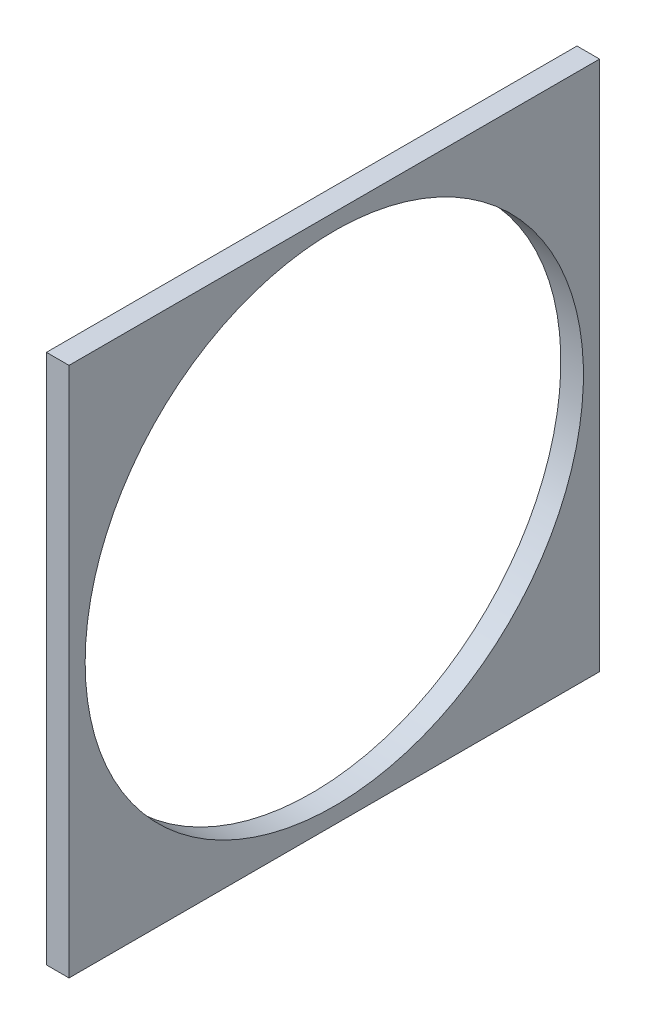
ISO-10303-21;
HEADER;
FILE_DESCRIPTION(('STEP AP214'),'2;1');
FILE_NAME('part.step','',(''),(''),'','','');
FILE_SCHEMA(('AUTOMOTIVE_DESIGN { 1 0 10303 214 1 1 1 1 }'));
ENDSEC;
DATA;
#1=APPLICATION_CONTEXT('core data for automotive mechanical design processes');
#2=APPLICATION_PROTOCOL_DEFINITION('international standard','automotive_design',2000,#1);
#3=PRODUCT_CONTEXT('',#1,'mechanical');
#4=PRODUCT('Part','Part','',(#3));
#5=PRODUCT_RELATED_PRODUCT_CATEGORY('part','',(#4));
#6=PRODUCT_DEFINITION_FORMATION('','',#4);
#7=PRODUCT_DEFINITION_CONTEXT('part definition',#1,'design');
#8=PRODUCT_DEFINITION('design','',#6,#7);
#9=PRODUCT_DEFINITION_SHAPE('','',#8);
#10=(LENGTH_UNIT() NAMED_UNIT(*) SI_UNIT(.MILLI.,.METRE.));
#11=(NAMED_UNIT(*) PLANE_ANGLE_UNIT() SI_UNIT($,.RADIAN.));
#12=(NAMED_UNIT(*) SI_UNIT($,.STERADIAN.) SOLID_ANGLE_UNIT());
#13=UNCERTAINTY_MEASURE_WITH_UNIT(LENGTH_MEASURE(1.E-05),#10,'distance_accuracy_value','');
#14=(GEOMETRIC_REPRESENTATION_CONTEXT(3) GLOBAL_UNCERTAINTY_ASSIGNED_CONTEXT((#13)) GLOBAL_UNIT_ASSIGNED_CONTEXT((#10,
#11,#12)) REPRESENTATION_CONTEXT('',''));
#15=CARTESIAN_POINT('',(0.,0.,0.));
#16=DIRECTION('',(0.,0.,1.));
#17=DIRECTION('',(1.,0.,0.));
#18=AXIS2_PLACEMENT_3D('',#15,#16,#17);
#19=CARTESIAN_POINT('',(21.,0.,0.));
#20=DIRECTION('',(1.,0.,0.));
#21=DIRECTION('',(0.,0.,-1.));
#22=AXIS2_PLACEMENT_3D('',#19,#20,#21);
#23=PLANE('',#22);
#24=DIRECTION('',(0.,-1.,0.));
#25=VECTOR('',#24,1.);
#26=CARTESIAN_POINT('',(21.,-246.57,246.57));
#27=LINE('',#26,#25);
#28=CARTESIAN_POINT('',(21.,246.57,246.57));
#29=VERTEX_POINT('',#28);
#30=CARTESIAN_POINT('',(21.,-246.57,246.57));
#31=VERTEX_POINT('',#30);
#32=EDGE_CURVE('E94',#29,#31,#27,.T.);
#33=ORIENTED_EDGE('',*,*,#32,.T.);
#34=DIRECTION('',(0.,0.,-1.));
#35=VECTOR('',#34,1.);
#36=CARTESIAN_POINT('',(21.,-246.57,-246.57));
#37=LINE('',#36,#35);
#38=CARTESIAN_POINT('',(21.,-246.57,-246.57));
#39=VERTEX_POINT('',#38);
#40=EDGE_CURVE('E89',#31,#39,#37,.T.);
#41=ORIENTED_EDGE('',*,*,#40,.T.);
#42=DIRECTION('',(0.,1.,0.));
#43=VECTOR('',#42,1.);
#44=CARTESIAN_POINT('',(21.,-246.57,-246.57));
#45=LINE('',#44,#43);
#46=CARTESIAN_POINT('',(21.,246.57,-246.57));
#47=VERTEX_POINT('',#46);
#48=EDGE_CURVE('E92',#39,#47,#45,.T.);
#49=ORIENTED_EDGE('',*,*,#48,.T.);
#50=DIRECTION('',(0.,0.,1.));
#51=VECTOR('',#50,1.);
#52=CARTESIAN_POINT('',(21.,246.57,-246.57));
#53=LINE('',#52,#51);
#54=EDGE_CURVE('E59',#47,#29,#53,.T.);
#55=ORIENTED_EDGE('',*,*,#54,.T.);
#56=EDGE_LOOP('',(#33,#41,#49,#55));
#57=FACE_BOUND('',#56,.T.);
#58=CARTESIAN_POINT('',(21.,0.,0.));
#59=DIRECTION('',(1.,0.,0.));
#60=DIRECTION('',(0.,0.,-1.));
#61=AXIS2_PLACEMENT_3D('',#58,#59,#60);
#62=CIRCLE('',#61,231.57);
#63=CARTESIAN_POINT('',(21.,0.,231.57));
#64=VERTEX_POINT('',#63);
#65=EDGE_CURVE('E109',#64,#64,#62,.T.);
#66=ORIENTED_EDGE('',*,*,#65,.F.);
#67=EDGE_LOOP('',(#66));
#68=FACE_BOUND('',#67,.T.);
#69=ADVANCED_FACE('F42',(#57,#68),#23,.T.);
#70=CARTESIAN_POINT('',(0.,0.,0.));
#71=DIRECTION('',(1.,0.,0.));
#72=DIRECTION('',(0.,0.,-1.));
#73=AXIS2_PLACEMENT_3D('',#70,#71,#72);
#74=PLANE('',#73);
#75=DIRECTION('',(0.,-1.,0.));
#76=VECTOR('',#75,1.);
#77=CARTESIAN_POINT('',(0.,-246.57,246.57));
#78=LINE('',#77,#76);
#79=CARTESIAN_POINT('',(0.,246.57,246.57));
#80=VERTEX_POINT('',#79);
#81=CARTESIAN_POINT('',(0.,-246.57,246.57));
#82=VERTEX_POINT('',#81);
#83=EDGE_CURVE('E106',#80,#82,#78,.T.);
#84=ORIENTED_EDGE('',*,*,#83,.F.);
#85=DIRECTION('',(0.,0.,1.));
#86=VECTOR('',#85,1.);
#87=CARTESIAN_POINT('',(0.,246.57,-246.57));
#88=LINE('',#87,#86);
#89=CARTESIAN_POINT('',(0.,246.57,-246.57));
#90=VERTEX_POINT('',#89);
#91=EDGE_CURVE('E82',#90,#80,#88,.T.);
#92=ORIENTED_EDGE('',*,*,#91,.F.);
#93=DIRECTION('',(0.,1.,0.));
#94=VECTOR('',#93,1.);
#95=CARTESIAN_POINT('',(0.,-246.57,-246.57));
#96=LINE('',#95,#94);
#97=CARTESIAN_POINT('',(0.,-246.57,-246.57));
#98=VERTEX_POINT('',#97);
#99=EDGE_CURVE('E76',#98,#90,#96,.T.);
#100=ORIENTED_EDGE('',*,*,#99,.F.);
#101=DIRECTION('',(0.,0.,-1.));
#102=VECTOR('',#101,1.);
#103=CARTESIAN_POINT('',(0.,-246.57,-246.57));
#104=LINE('',#103,#102);
#105=EDGE_CURVE('E98',#82,#98,#104,.T.);
#106=ORIENTED_EDGE('',*,*,#105,.F.);
#107=EDGE_LOOP('',(#84,#92,#100,#106));
#108=FACE_BOUND('',#107,.T.);
#109=CARTESIAN_POINT('',(0.,0.,0.));
#110=DIRECTION('',(1.,0.,0.));
#111=DIRECTION('',(0.,0.,-1.));
#112=AXIS2_PLACEMENT_3D('',#109,#110,#111);
#113=CIRCLE('',#112,231.57);
#114=CARTESIAN_POINT('',(0.,0.,231.57));
#115=VERTEX_POINT('',#114);
#116=EDGE_CURVE('E121',#115,#115,#113,.T.);
#117=ORIENTED_EDGE('',*,*,#116,.T.);
#118=EDGE_LOOP('',(#117));
#119=FACE_BOUND('',#118,.T.);
#120=ADVANCED_FACE('F117',(#108,#119),#74,.F.);
#121=CARTESIAN_POINT('',(21.,-246.57,246.57));
#122=DIRECTION('',(0.,0.,-1.));
#123=DIRECTION('',(-1.,0.,0.));
#124=AXIS2_PLACEMENT_3D('',#121,#122,#123);
#125=PLANE('',#124);
#126=ORIENTED_EDGE('',*,*,#83,.T.);
#127=DIRECTION('',(-1.,0.,0.));
#128=VECTOR('',#127,1.);
#129=CARTESIAN_POINT('',(21.,-246.57,246.57));
#130=LINE('',#129,#128);
#131=EDGE_CURVE('E11',#31,#82,#130,.T.);
#132=ORIENTED_EDGE('',*,*,#131,.F.);
#133=ORIENTED_EDGE('',*,*,#32,.F.);
#134=DIRECTION('',(-1.,0.,0.));
#135=VECTOR('',#134,1.);
#136=CARTESIAN_POINT('',(21.,246.57,246.57));
#137=LINE('',#136,#135);
#138=EDGE_CURVE('E102',#29,#80,#137,.T.);
#139=ORIENTED_EDGE('',*,*,#138,.T.);
#140=EDGE_LOOP('',(#126,#132,#133,#139));
#141=FACE_BOUND('',#140,.T.);
#142=ADVANCED_FACE('F44',(#141),#125,.F.);
#143=CARTESIAN_POINT('',(21.,-246.57,-246.57));
#144=DIRECTION('',(0.,1.,0.));
#145=DIRECTION('',(0.,0.,1.));
#146=AXIS2_PLACEMENT_3D('',#143,#144,#145);
#147=PLANE('',#146);
#148=ORIENTED_EDGE('',*,*,#105,.T.);
#149=DIRECTION('',(-1.,0.,0.));
#150=VECTOR('',#149,1.);
#151=CARTESIAN_POINT('',(21.,-246.57,-246.57));
#152=LINE('',#151,#150);
#153=EDGE_CURVE('E51',#39,#98,#152,.T.);
#154=ORIENTED_EDGE('',*,*,#153,.F.);
#155=ORIENTED_EDGE('',*,*,#40,.F.);
#156=ORIENTED_EDGE('',*,*,#131,.T.);
#157=EDGE_LOOP('',(#148,#154,#155,#156));
#158=FACE_BOUND('',#157,.T.);
#159=ADVANCED_FACE('F97',(#158),#147,.F.);
#160=CARTESIAN_POINT('',(21.,-246.57,-246.57));
#161=DIRECTION('',(0.,0.,1.));
#162=DIRECTION('',(1.,0.,0.));
#163=AXIS2_PLACEMENT_3D('',#160,#161,#162);
#164=PLANE('',#163);
#165=ORIENTED_EDGE('',*,*,#99,.T.);
#166=DIRECTION('',(-1.,0.,0.));
#167=VECTOR('',#166,1.);
#168=CARTESIAN_POINT('',(21.,246.57,-246.57));
#169=LINE('',#168,#167);
#170=EDGE_CURVE('E99',#47,#90,#169,.T.);
#171=ORIENTED_EDGE('',*,*,#170,.F.);
#172=ORIENTED_EDGE('',*,*,#48,.F.);
#173=ORIENTED_EDGE('',*,*,#153,.T.);
#174=EDGE_LOOP('',(#165,#171,#172,#173));
#175=FACE_BOUND('',#174,.T.);
#176=ADVANCED_FACE('F100',(#175),#164,.F.);
#177=CARTESIAN_POINT('',(21.,246.57,-246.57));
#178=DIRECTION('',(0.,-1.,0.));
#179=DIRECTION('',(0.,0.,-1.));
#180=AXIS2_PLACEMENT_3D('',#177,#178,#179);
#181=PLANE('',#180);
#182=ORIENTED_EDGE('',*,*,#91,.T.);
#183=ORIENTED_EDGE('',*,*,#138,.F.);
#184=ORIENTED_EDGE('',*,*,#54,.F.);
#185=ORIENTED_EDGE('',*,*,#170,.T.);
#186=EDGE_LOOP('',(#182,#183,#184,#185));
#187=FACE_BOUND('',#186,.T.);
#188=ADVANCED_FACE('F114',(#187),#181,.F.);
#189=CARTESIAN_POINT('',(21.,0.,0.));
#190=DIRECTION('',(-1.,0.,0.));
#191=DIRECTION('',(0.,0.,1.));
#192=AXIS2_PLACEMENT_3D('',#189,#190,#191);
#193=CYLINDRICAL_SURFACE('',#192,231.57);
#194=CARTESIAN_POINT('',(21.,0.,231.57));
#195=CARTESIAN_POINT('',(20.78125,0.,231.57));
#196=CARTESIAN_POINT('',(20.5625,0.,231.57));
#197=CARTESIAN_POINT('',(20.125,0.,231.57));
#198=CARTESIAN_POINT('',(19.90625,0.,231.57));
#199=CARTESIAN_POINT('',(19.46875,0.,231.57));
#200=CARTESIAN_POINT('',(19.25,0.,231.57));
#201=CARTESIAN_POINT('',(18.8125,0.,231.57));
#202=CARTESIAN_POINT('',(18.59375,0.,231.57));
#203=CARTESIAN_POINT('',(18.15625,0.,231.57));
#204=CARTESIAN_POINT('',(17.9375,0.,231.57));
#205=CARTESIAN_POINT('',(17.5,0.,231.57));
#206=CARTESIAN_POINT('',(17.28125,0.,231.57));
#207=CARTESIAN_POINT('',(16.84375,0.,231.57));
#208=CARTESIAN_POINT('',(16.625,0.,231.57));
#209=CARTESIAN_POINT('',(16.1875,0.,231.57));
#210=CARTESIAN_POINT('',(15.96875,0.,231.57));
#211=CARTESIAN_POINT('',(15.53125,0.,231.57));
#212=CARTESIAN_POINT('',(15.3125,0.,231.57));
#213=CARTESIAN_POINT('',(14.875,0.,231.57));
#214=CARTESIAN_POINT('',(14.65625,0.,231.57));
#215=CARTESIAN_POINT('',(14.21875,0.,231.57));
#216=CARTESIAN_POINT('',(14.,0.,231.57));
#217=CARTESIAN_POINT('',(13.5625,0.,231.57));
#218=CARTESIAN_POINT('',(13.34375,0.,231.57));
#219=CARTESIAN_POINT('',(12.90625,0.,231.57));
#220=CARTESIAN_POINT('',(12.6875,0.,231.57));
#221=CARTESIAN_POINT('',(12.25,0.,231.57));
#222=CARTESIAN_POINT('',(12.03125,0.,231.57));
#223=CARTESIAN_POINT('',(11.59375,0.,231.57));
#224=CARTESIAN_POINT('',(11.375,0.,231.57));
#225=CARTESIAN_POINT('',(10.9375,0.,231.57));
#226=CARTESIAN_POINT('',(10.71875,0.,231.57));
#227=CARTESIAN_POINT('',(10.28125,0.,231.57));
#228=CARTESIAN_POINT('',(10.0625,0.,231.57));
#229=CARTESIAN_POINT('',(9.625,0.,231.57));
#230=CARTESIAN_POINT('',(9.40625,0.,231.57));
#231=CARTESIAN_POINT('',(8.96875,0.,231.57));
#232=CARTESIAN_POINT('',(8.75,0.,231.57));
#233=CARTESIAN_POINT('',(8.3125,0.,231.57));
#234=CARTESIAN_POINT('',(8.09375,0.,231.57));
#235=CARTESIAN_POINT('',(7.65625,0.,231.57));
#236=CARTESIAN_POINT('',(7.4375,0.,231.57));
#237=CARTESIAN_POINT('',(7.,0.,231.57));
#238=CARTESIAN_POINT('',(6.78125,0.,231.57));
#239=CARTESIAN_POINT('',(6.34375,0.,231.57));
#240=CARTESIAN_POINT('',(6.125,0.,231.57));
#241=CARTESIAN_POINT('',(5.6875,0.,231.57));
#242=CARTESIAN_POINT('',(5.46875,0.,231.57));
#243=CARTESIAN_POINT('',(5.03125,0.,231.57));
#244=CARTESIAN_POINT('',(4.8125,0.,231.57));
#245=CARTESIAN_POINT('',(4.375,0.,231.57));
#246=CARTESIAN_POINT('',(4.15625,0.,231.57));
#247=CARTESIAN_POINT('',(3.71875,0.,231.57));
#248=CARTESIAN_POINT('',(3.5,0.,231.57));
#249=CARTESIAN_POINT('',(3.0625,0.,231.57));
#250=CARTESIAN_POINT('',(2.84375,0.,231.57));
#251=CARTESIAN_POINT('',(2.40625,0.,231.57));
#252=CARTESIAN_POINT('',(2.1875,0.,231.57));
#253=CARTESIAN_POINT('',(1.75,0.,231.57));
#254=CARTESIAN_POINT('',(1.53125,0.,231.57));
#255=CARTESIAN_POINT('',(1.09375,0.,231.57));
#256=CARTESIAN_POINT('',(0.875000000000001,0.,231.57));
#257=CARTESIAN_POINT('',(0.4375,0.,231.57));
#258=CARTESIAN_POINT('',(0.21875,0.,231.57));
#259=CARTESIAN_POINT('',(0.,0.,231.57));
#260=B_SPLINE_CURVE_WITH_KNOTS('',3,(#194,#195,#196,#197,#198,#199,#200,#201,#202,#203,#204,
#205,#206,#207,#208,#209,#210,#211,#212,#213,#214,#215,#216,#217,#218,#219,#220,#221,#222,#223,
#224,#225,#226,#227,#228,#229,#230,#231,#232,#233,#234,#235,#236,#237,#238,#239,#240,#241,#242,
#243,#244,#245,#246,#247,#248,#249,#250,#251,#252,#253,#254,#255,#256,#257,#258,#259),
.UNSPECIFIED.,.F.,.F.,(4,2,2,2,2,2,2,2,2,2,2,2,2,2,2,2,2,2,2,2,2,2,2,2,2,2,2,2,2,2,2,2,4),(0.,
0.656250000000001,1.3125,1.96875,2.625,3.28125,3.9375,4.59375,5.25,5.90625,6.5625,7.21875,7.875,
8.53125,9.1875,9.84375,10.5,11.15625,11.8125,12.46875,13.125,13.78125,14.4375,15.09375,15.75,
16.40625,17.0625,17.71875,18.375,19.03125,19.6875,20.34375,21.),.UNSPECIFIED.);
#261=EDGE_CURVE('BSEAM127',#64,#115,#260,.T.);
#262=ORIENTED_EDGE('',*,*,#65,.T.);
#263=ORIENTED_EDGE('',*,*,#116,.F.);
#264=ORIENTED_EDGE('',*,*,#261,.T.);
#265=ORIENTED_EDGE('',*,*,#261,.F.);
#266=EDGE_LOOP('',(#262,#264,#263,#265));
#267=FACE_BOUND('',#266,.T.);
#268=ADVANCED_FACE('F127',(#267),#193,.F.);
#269=CLOSED_SHELL('',(#69,#120,#142,#159,#176,#188,#268));
#270=MANIFOLD_SOLID_BREP('B2',#269);
#271=ADVANCED_BREP_SHAPE_REPRESENTATION('',(#18,#270),#14);
#272=SHAPE_DEFINITION_REPRESENTATION(#9,#271);
ENDSEC;
END-ISO-10303-21;
